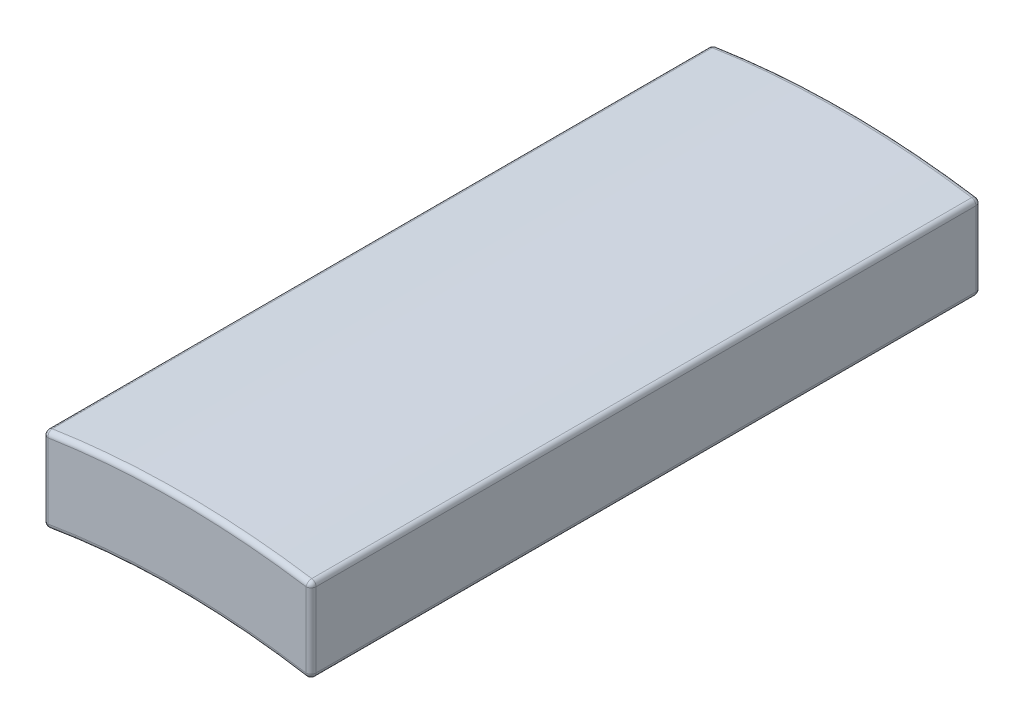
ISO-10303-21;
HEADER;
FILE_DESCRIPTION(('STEP AP214'),'2;1');
FILE_NAME('part.step','',(''),(''),'','','');
FILE_SCHEMA(('AUTOMOTIVE_DESIGN { 1 0 10303 214 1 1 1 1 }'));
ENDSEC;
DATA;
#1=APPLICATION_CONTEXT('core data for automotive mechanical design processes');
#2=APPLICATION_PROTOCOL_DEFINITION('international standard','automotive_design',2000,#1);
#3=PRODUCT_CONTEXT('',#1,'mechanical');
#4=PRODUCT('Part','Part','',(#3));
#5=PRODUCT_RELATED_PRODUCT_CATEGORY('part','',(#4));
#6=PRODUCT_DEFINITION_FORMATION('','',#4);
#7=PRODUCT_DEFINITION_CONTEXT('part definition',#1,'design');
#8=PRODUCT_DEFINITION('design','',#6,#7);
#9=PRODUCT_DEFINITION_SHAPE('','',#8);
#10=(LENGTH_UNIT() NAMED_UNIT(*) SI_UNIT(.MILLI.,.METRE.));
#11=(NAMED_UNIT(*) PLANE_ANGLE_UNIT() SI_UNIT($,.RADIAN.));
#12=(NAMED_UNIT(*) SI_UNIT($,.STERADIAN.) SOLID_ANGLE_UNIT());
#13=UNCERTAINTY_MEASURE_WITH_UNIT(LENGTH_MEASURE(1.E-05),#10,'distance_accuracy_value','');
#14=(GEOMETRIC_REPRESENTATION_CONTEXT(3) GLOBAL_UNCERTAINTY_ASSIGNED_CONTEXT((#13)) GLOBAL_UNIT_ASSIGNED_CONTEXT((#10,
#11,#12)) REPRESENTATION_CONTEXT('',''));
#15=CARTESIAN_POINT('',(0.,0.,0.));
#16=DIRECTION('',(0.,0.,1.));
#17=DIRECTION('',(1.,0.,0.));
#18=AXIS2_PLACEMENT_3D('',#15,#16,#17);
#19=CARTESIAN_POINT('',(3.85,22.8276148556962,0.150000000000001));
#20=DIRECTION('',(1.,0.,0.));
#21=DIRECTION('',(0.,0.,-1.));
#22=AXIS2_PLACEMENT_3D('',#19,#20,#21);
#23=SPHERICAL_SURFACE('',#22,0.15);
#24=CARTESIAN_POINT('',(3.85,22.8276148556962,0.150000000000001));
#25=DIRECTION('',(0.,0.,-1.));
#26=DIRECTION('',(-1.,0.,0.));
#27=AXIS2_PLACEMENT_3D('',#24,#25,#26);
#28=CIRCLE('',#27,0.149999999999999);
#29=CARTESIAN_POINT('',(3.82505399568035,22.6797037443202,0.150000000000001));
#30=VERTEX_POINT('',#29);
#31=CARTESIAN_POINT('',(4.,22.8276148556962,0.150000000000001));
#32=VERTEX_POINT('',#31);
#33=EDGE_CURVE('E63',#30,#32,#28,.F.);
#34=ORIENTED_EDGE('',*,*,#33,.F.);
#35=CARTESIAN_POINT('',(3.85,22.8276148556962,0.150000000000001));
#36=DIRECTION('',(-0.986074075840007,0.166306695464363,0.));
#37=DIRECTION('',(0.166306695464363,0.986074075840007,0.));
#38=AXIS2_PLACEMENT_3D('',#35,#36,#37);
#39=CIRCLE('',#38,0.15);
#40=CARTESIAN_POINT('',(3.85,22.8276148556962,0.));
#41=VERTEX_POINT('',#40);
#42=EDGE_CURVE('E84',#41,#30,#39,.T.);
#43=ORIENTED_EDGE('',*,*,#42,.F.);
#44=CARTESIAN_POINT('',(3.85,22.8276148556962,0.150000000000001));
#45=DIRECTION('',(0.,1.,0.));
#46=DIRECTION('',(0.,0.,1.));
#47=AXIS2_PLACEMENT_3D('',#44,#45,#46);
#48=CIRCLE('',#47,0.15);
#49=EDGE_CURVE('E94',#32,#41,#48,.T.);
#50=ORIENTED_EDGE('',*,*,#49,.F.);
#51=EDGE_LOOP('',(#34,#43,#50));
#52=FACE_BOUND('',#51,.T.);
#53=ADVANCED_FACE('F17',(#52),#23,.T.);
#54=CARTESIAN_POINT('',(-3.85,22.8276148556962,0.150000000000001));
#55=DIRECTION('',(1.,0.,0.));
#56=DIRECTION('',(0.,0.,-1.));
#57=AXIS2_PLACEMENT_3D('',#54,#55,#56);
#58=SPHERICAL_SURFACE('',#57,0.15);
#59=CARTESIAN_POINT('',(-3.85,22.8276148556962,0.150000000000001));
#60=DIRECTION('',(0.,-1.,0.));
#61=DIRECTION('',(0.,0.,-1.));
#62=AXIS2_PLACEMENT_3D('',#59,#60,#61);
#63=CIRCLE('',#62,0.15);
#64=CARTESIAN_POINT('',(-3.85,22.8276148556962,0.));
#65=VERTEX_POINT('',#64);
#66=CARTESIAN_POINT('',(-4.,22.8276148556962,0.150000000000001));
#67=VERTEX_POINT('',#66);
#68=EDGE_CURVE('E78',#65,#67,#63,.F.);
#69=ORIENTED_EDGE('',*,*,#68,.F.);
#70=CARTESIAN_POINT('',(-3.85,22.8276148556962,0.150000000000001));
#71=DIRECTION('',(-0.986074075840007,-0.166306695464363,0.));
#72=DIRECTION('',(-0.166306695464363,0.986074075840007,0.));
#73=AXIS2_PLACEMENT_3D('',#70,#71,#72);
#74=CIRCLE('',#73,0.15);
#75=CARTESIAN_POINT('',(-3.82505399568035,22.6797037443202,0.150000000000001));
#76=VERTEX_POINT('',#75);
#77=EDGE_CURVE('E70',#76,#65,#74,.F.);
#78=ORIENTED_EDGE('',*,*,#77,.F.);
#79=CARTESIAN_POINT('',(-3.85,22.8276148556962,0.150000000000001));
#80=DIRECTION('',(0.,0.,-1.));
#81=DIRECTION('',(-1.,0.,0.));
#82=AXIS2_PLACEMENT_3D('',#79,#80,#81);
#83=CIRCLE('',#82,0.149999999999999);
#84=EDGE_CURVE('E74',#67,#76,#83,.F.);
#85=ORIENTED_EDGE('',*,*,#84,.F.);
#86=EDGE_LOOP('',(#69,#78,#85));
#87=FACE_BOUND('',#86,.T.);
#88=ADVANCED_FACE('F72',(#87),#58,.T.);
#89=CARTESIAN_POINT('',(-3.85,22.8276148556962,19.85));
#90=DIRECTION('',(1.,0.,0.));
#91=DIRECTION('',(0.,0.,-1.));
#92=AXIS2_PLACEMENT_3D('',#89,#90,#91);
#93=SPHERICAL_SURFACE('',#92,0.15);
#94=CARTESIAN_POINT('',(-3.85,22.8276148556962,19.85));
#95=DIRECTION('',(-0.986074075840007,-0.166306695464363,0.));
#96=DIRECTION('',(-0.166306695464363,0.986074075840007,0.));
#97=AXIS2_PLACEMENT_3D('',#94,#95,#96);
#98=CIRCLE('',#97,0.15);
#99=CARTESIAN_POINT('',(-3.85,22.8276148556962,20.));
#100=VERTEX_POINT('',#99);
#101=CARTESIAN_POINT('',(-3.82505399568035,22.6797037443202,19.85));
#102=VERTEX_POINT('',#101);
#103=EDGE_CURVE('E137',#100,#102,#98,.F.);
#104=ORIENTED_EDGE('',*,*,#103,.F.);
#105=CARTESIAN_POINT('',(-3.85,22.8276148556962,19.85));
#106=DIRECTION('',(0.,1.,0.));
#107=DIRECTION('',(0.,0.,1.));
#108=AXIS2_PLACEMENT_3D('',#105,#106,#107);
#109=CIRCLE('',#108,0.150000000000001);
#110=CARTESIAN_POINT('',(-4.,22.8276148556962,19.85));
#111=VERTEX_POINT('',#110);
#112=EDGE_CURVE('E145',#111,#100,#109,.T.);
#113=ORIENTED_EDGE('',*,*,#112,.F.);
#114=CARTESIAN_POINT('',(-3.85,22.8276148556962,19.85));
#115=DIRECTION('',(0.,0.,-1.));
#116=DIRECTION('',(-1.,0.,0.));
#117=AXIS2_PLACEMENT_3D('',#114,#115,#116);
#118=CIRCLE('',#117,0.149999999999999);
#119=EDGE_CURVE('E104',#102,#111,#118,.T.);
#120=ORIENTED_EDGE('',*,*,#119,.F.);
#121=EDGE_LOOP('',(#104,#113,#120));
#122=FACE_BOUND('',#121,.T.);
#123=ADVANCED_FACE('F228',(#122),#93,.T.);
#124=CARTESIAN_POINT('',(0.,0.,20.));
#125=DIRECTION('',(0.,0.,-1.));
#126=DIRECTION('',(-1.,0.,0.));
#127=AXIS2_PLACEMENT_3D('',#124,#125,#126);
#128=CYLINDRICAL_SURFACE('',#127,23.);
#129=CARTESIAN_POINT('',(0.,0.,0.150000000000001));
#130=DIRECTION('',(0.,0.,1.));
#131=DIRECTION('',(1.,0.,0.));
#132=AXIS2_PLACEMENT_3D('',#129,#130,#131);
#133=CIRCLE('',#132,23.);
#134=EDGE_CURVE('E100',#30,#76,#133,.T.);
#135=ORIENTED_EDGE('',*,*,#134,.F.);
#136=DIRECTION('',(0.,0.,-1.));
#137=VECTOR('',#136,1.);
#138=CARTESIAN_POINT('',(3.82505399568035,22.6797037443202,20.));
#139=LINE('',#138,#137);
#140=CARTESIAN_POINT('',(3.82505399568035,22.6797037443202,19.85));
#141=VERTEX_POINT('',#140);
#142=EDGE_CURVE('E113',#141,#30,#139,.T.);
#143=ORIENTED_EDGE('',*,*,#142,.F.);
#144=CARTESIAN_POINT('',(0.,0.,19.85));
#145=DIRECTION('',(0.,0.,1.));
#146=DIRECTION('',(1.,0.,0.));
#147=AXIS2_PLACEMENT_3D('',#144,#145,#146);
#148=CIRCLE('',#147,23.);
#149=EDGE_CURVE('E103',#102,#141,#148,.F.);
#150=ORIENTED_EDGE('',*,*,#149,.F.);
#151=DIRECTION('',(0.,0.,-1.));
#152=VECTOR('',#151,1.);
#153=CARTESIAN_POINT('',(-3.82505399568035,22.6797037443202,20.));
#154=LINE('',#153,#152);
#155=EDGE_CURVE('E91',#76,#102,#154,.F.);
#156=ORIENTED_EDGE('',*,*,#155,.F.);
#157=EDGE_LOOP('',(#135,#143,#150,#156));
#158=FACE_BOUND('',#157,.T.);
#159=ADVANCED_FACE('F99',(#158),#128,.F.);
#160=CARTESIAN_POINT('',(3.85,22.8276148556962,19.85));
#161=DIRECTION('',(1.,0.,0.));
#162=DIRECTION('',(0.,0.,-1.));
#163=AXIS2_PLACEMENT_3D('',#160,#161,#162);
#164=SPHERICAL_SURFACE('',#163,0.15);
#165=CARTESIAN_POINT('',(3.85,22.8276148556962,19.85));
#166=DIRECTION('',(0.,-1.,0.));
#167=DIRECTION('',(0.,0.,-1.));
#168=AXIS2_PLACEMENT_3D('',#165,#166,#167);
#169=CIRCLE('',#168,0.150000000000001);
#170=CARTESIAN_POINT('',(3.85,22.8276148556962,20.));
#171=VERTEX_POINT('',#170);
#172=CARTESIAN_POINT('',(4.,22.8276148556962,19.85));
#173=VERTEX_POINT('',#172);
#174=EDGE_CURVE('E234',#171,#173,#169,.F.);
#175=ORIENTED_EDGE('',*,*,#174,.F.);
#176=CARTESIAN_POINT('',(3.85,22.8276148556962,19.85));
#177=DIRECTION('',(-0.986074075840007,0.166306695464363,0.));
#178=DIRECTION('',(0.166306695464363,0.986074075840007,0.));
#179=AXIS2_PLACEMENT_3D('',#176,#177,#178);
#180=CIRCLE('',#179,0.15);
#181=EDGE_CURVE('E140',#141,#171,#180,.T.);
#182=ORIENTED_EDGE('',*,*,#181,.F.);
#183=CARTESIAN_POINT('',(3.85,22.8276148556962,19.85));
#184=DIRECTION('',(0.,0.,-1.));
#185=DIRECTION('',(-1.,0.,0.));
#186=AXIS2_PLACEMENT_3D('',#183,#184,#185);
#187=CIRCLE('',#186,0.149999999999999);
#188=EDGE_CURVE('E85',#173,#141,#187,.T.);
#189=ORIENTED_EDGE('',*,*,#188,.F.);
#190=EDGE_LOOP('',(#175,#182,#189));
#191=FACE_BOUND('',#190,.T.);
#192=ADVANCED_FACE('F222',(#191),#164,.T.);
#193=CARTESIAN_POINT('',(3.85,22.8276148556962,20.));
#194=DIRECTION('',(0.,0.,-1.));
#195=DIRECTION('',(-1.,0.,0.));
#196=AXIS2_PLACEMENT_3D('',#193,#194,#195);
#197=CYLINDRICAL_SURFACE('',#196,0.149999999999999);
#198=DIRECTION('',(0.,0.,1.));
#199=VECTOR('',#198,1.);
#200=CARTESIAN_POINT('',(4.,22.8276148556962,20.));
#201=LINE('',#200,#199);
#202=EDGE_CURVE('E207',#32,#173,#201,.T.);
#203=ORIENTED_EDGE('',*,*,#202,.T.);
#204=ORIENTED_EDGE('',*,*,#188,.T.);
#205=ORIENTED_EDGE('',*,*,#142,.T.);
#206=ORIENTED_EDGE('',*,*,#33,.T.);
#207=EDGE_LOOP('',(#203,#204,#205,#206));
#208=FACE_BOUND('',#207,.T.);
#209=ADVANCED_FACE('F193',(#208),#197,.T.);
#210=CARTESIAN_POINT('',(0.,0.,0.150000000000001));
#211=DIRECTION('',(0.,0.,1.));
#212=DIRECTION('',(1.,0.,0.));
#213=AXIS2_PLACEMENT_3D('',#210,#211,#212);
#214=TOROIDAL_SURFACE('',#213,23.15,0.15);
#215=ORIENTED_EDGE('',*,*,#42,.T.);
#216=ORIENTED_EDGE('',*,*,#134,.T.);
#217=ORIENTED_EDGE('',*,*,#77,.T.);
#218=CARTESIAN_POINT('',(0.,0.,0.));
#219=DIRECTION('',(0.,0.,-1.));
#220=DIRECTION('',(-0.166306695464363,0.986074075840007,0.));
#221=AXIS2_PLACEMENT_3D('',#218,#219,#220);
#222=CIRCLE('',#221,23.15);
#223=EDGE_CURVE('E458',#65,#41,#222,.T.);
#224=ORIENTED_EDGE('',*,*,#223,.T.);
#225=EDGE_LOOP('',(#215,#216,#217,#224));
#226=FACE_BOUND('',#225,.T.);
#227=ADVANCED_FACE('F106',(#226),#214,.T.);
#228=CARTESIAN_POINT('',(3.85,22.8276148556962,0.150000000000001));
#229=DIRECTION('',(0.,1.,0.));
#230=DIRECTION('',(0.,0.,1.));
#231=AXIS2_PLACEMENT_3D('',#228,#229,#230);
#232=CYLINDRICAL_SURFACE('',#231,0.15);
#233=ORIENTED_EDGE('',*,*,#49,.T.);
#234=DIRECTION('',(0.,1.,0.));
#235=VECTOR('',#234,1.);
#236=CARTESIAN_POINT('',(3.85,22.8276148556962,0.));
#237=LINE('',#236,#235);
#238=CARTESIAN_POINT('',(3.85,25.0559374201006,0.));
#239=VERTEX_POINT('',#238);
#240=EDGE_CURVE('E464',#41,#239,#237,.T.);
#241=ORIENTED_EDGE('',*,*,#240,.T.);
#242=CARTESIAN_POINT('',(3.85,25.0559374201006,0.150000000000001));
#243=DIRECTION('',(0.,1.,0.));
#244=DIRECTION('',(1.,0.,0.));
#245=AXIS2_PLACEMENT_3D('',#242,#243,#244);
#246=CIRCLE('',#245,0.15);
#247=CARTESIAN_POINT('',(4.,25.0559374201006,0.150000000000001));
#248=VERTEX_POINT('',#247);
#249=EDGE_CURVE('E210',#248,#239,#246,.T.);
#250=ORIENTED_EDGE('',*,*,#249,.F.);
#251=DIRECTION('',(0.,1.,0.));
#252=VECTOR('',#251,1.);
#253=CARTESIAN_POINT('',(4.,22.8276148556962,0.150000000000001));
#254=LINE('',#253,#252);
#255=EDGE_CURVE('E211',#248,#32,#254,.F.);
#256=ORIENTED_EDGE('',*,*,#255,.T.);
#257=EDGE_LOOP('',(#233,#241,#250,#256));
#258=FACE_BOUND('',#257,.T.);
#259=ADVANCED_FACE('F192',(#258),#232,.T.);
#260=CARTESIAN_POINT('',(-3.85,22.8276148556962,20.));
#261=DIRECTION('',(0.,0.,-1.));
#262=DIRECTION('',(-1.,0.,0.));
#263=AXIS2_PLACEMENT_3D('',#260,#261,#262);
#264=CYLINDRICAL_SURFACE('',#263,0.149999999999999);
#265=ORIENTED_EDGE('',*,*,#155,.T.);
#266=ORIENTED_EDGE('',*,*,#119,.T.);
#267=DIRECTION('',(0.,0.,-1.));
#268=VECTOR('',#267,1.);
#269=CARTESIAN_POINT('',(-4.,22.8276148556962,20.));
#270=LINE('',#269,#268);
#271=EDGE_CURVE('E93',#111,#67,#270,.T.);
#272=ORIENTED_EDGE('',*,*,#271,.T.);
#273=ORIENTED_EDGE('',*,*,#84,.T.);
#274=EDGE_LOOP('',(#265,#266,#272,#273));
#275=FACE_BOUND('',#274,.T.);
#276=ADVANCED_FACE('F89',(#275),#264,.T.);
#277=CARTESIAN_POINT('',(-3.85,22.8276148556962,0.150000000000001));
#278=DIRECTION('',(0.,-1.,0.));
#279=DIRECTION('',(0.,0.,-1.));
#280=AXIS2_PLACEMENT_3D('',#277,#278,#279);
#281=CYLINDRICAL_SURFACE('',#280,0.15);
#282=ORIENTED_EDGE('',*,*,#68,.T.);
#283=DIRECTION('',(0.,1.,0.));
#284=VECTOR('',#283,1.);
#285=CARTESIAN_POINT('',(-4.,22.8276148556962,0.150000000000001));
#286=LINE('',#285,#284);
#287=CARTESIAN_POINT('',(-4.,25.0559374201006,0.150000000000001));
#288=VERTEX_POINT('',#287);
#289=EDGE_CURVE('E173',#67,#288,#286,.T.);
#290=ORIENTED_EDGE('',*,*,#289,.T.);
#291=CARTESIAN_POINT('',(-3.85,25.0559374201006,0.150000000000001));
#292=DIRECTION('',(0.,1.,0.));
#293=DIRECTION('',(1.,0.,0.));
#294=AXIS2_PLACEMENT_3D('',#291,#292,#293);
#295=CIRCLE('',#294,0.15);
#296=CARTESIAN_POINT('',(-3.85,25.0559374201006,0.));
#297=VERTEX_POINT('',#296);
#298=EDGE_CURVE('E424',#297,#288,#295,.T.);
#299=ORIENTED_EDGE('',*,*,#298,.F.);
#300=DIRECTION('',(0.,1.,0.));
#301=VECTOR('',#300,1.);
#302=CARTESIAN_POINT('',(-3.85,22.8276148556962,0.));
#303=LINE('',#302,#301);
#304=EDGE_CURVE('E455',#297,#65,#303,.F.);
#305=ORIENTED_EDGE('',*,*,#304,.T.);
#306=EDGE_LOOP('',(#282,#290,#299,#305));
#307=FACE_BOUND('',#306,.T.);
#308=ADVANCED_FACE('F259',(#307),#281,.T.);
#309=CARTESIAN_POINT('',(-3.85,22.8276148556962,19.85));
#310=DIRECTION('',(0.,1.,0.));
#311=DIRECTION('',(0.,0.,1.));
#312=AXIS2_PLACEMENT_3D('',#309,#310,#311);
#313=CYLINDRICAL_SURFACE('',#312,0.150000000000001);
#314=ORIENTED_EDGE('',*,*,#112,.T.);
#315=DIRECTION('',(0.,1.,0.));
#316=VECTOR('',#315,1.);
#317=CARTESIAN_POINT('',(-3.85,22.8276148556962,20.));
#318=LINE('',#317,#316);
#319=CARTESIAN_POINT('',(-3.85,25.0559374201006,20.));
#320=VERTEX_POINT('',#319);
#321=EDGE_CURVE('E367',#320,#100,#318,.F.);
#322=ORIENTED_EDGE('',*,*,#321,.F.);
#323=CARTESIAN_POINT('',(-3.85,25.0559374201006,19.85));
#324=DIRECTION('',(0.,-1.,0.));
#325=DIRECTION('',(1.,0.,0.));
#326=AXIS2_PLACEMENT_3D('',#323,#324,#325);
#327=CIRCLE('',#326,0.15);
#328=CARTESIAN_POINT('',(-4.,25.0559374201006,19.85));
#329=VERTEX_POINT('',#328);
#330=EDGE_CURVE('E377',#329,#320,#327,.F.);
#331=ORIENTED_EDGE('',*,*,#330,.F.);
#332=DIRECTION('',(0.,1.,0.));
#333=VECTOR('',#332,1.);
#334=CARTESIAN_POINT('',(-4.,22.8276148556962,19.85));
#335=LINE('',#334,#333);
#336=EDGE_CURVE('E174',#329,#111,#335,.F.);
#337=ORIENTED_EDGE('',*,*,#336,.T.);
#338=EDGE_LOOP('',(#314,#322,#331,#337));
#339=FACE_BOUND('',#338,.T.);
#340=ADVANCED_FACE('F255',(#339),#313,.T.);
#341=CARTESIAN_POINT('',(0.,0.,19.85));
#342=DIRECTION('',(0.,0.,1.));
#343=DIRECTION('',(1.,0.,0.));
#344=AXIS2_PLACEMENT_3D('',#341,#342,#343);
#345=TOROIDAL_SURFACE('',#344,23.15,0.15);
#346=ORIENTED_EDGE('',*,*,#103,.T.);
#347=ORIENTED_EDGE('',*,*,#149,.T.);
#348=ORIENTED_EDGE('',*,*,#181,.T.);
#349=CARTESIAN_POINT('',(0.,0.,20.));
#350=DIRECTION('',(0.,0.,1.));
#351=DIRECTION('',(0.166306695464363,0.986074075840007,0.));
#352=AXIS2_PLACEMENT_3D('',#349,#350,#351);
#353=CIRCLE('',#352,23.15);
#354=EDGE_CURVE('E354',#100,#171,#353,.F.);
#355=ORIENTED_EDGE('',*,*,#354,.F.);
#356=EDGE_LOOP('',(#346,#347,#348,#355));
#357=FACE_BOUND('',#356,.T.);
#358=ADVANCED_FACE('F249',(#357),#345,.T.);
#359=CARTESIAN_POINT('',(3.85,22.8276148556962,19.85));
#360=DIRECTION('',(0.,-1.,0.));
#361=DIRECTION('',(0.,0.,-1.));
#362=AXIS2_PLACEMENT_3D('',#359,#360,#361);
#363=CYLINDRICAL_SURFACE('',#362,0.150000000000001);
#364=CARTESIAN_POINT('',(3.85,25.0559374201006,19.85));
#365=DIRECTION('',(0.,-1.,0.));
#366=DIRECTION('',(1.,0.,0.));
#367=AXIS2_PLACEMENT_3D('',#364,#365,#366);
#368=CIRCLE('',#367,0.15);
#369=CARTESIAN_POINT('',(3.85,25.0559374201006,20.));
#370=VERTEX_POINT('',#369);
#371=CARTESIAN_POINT('',(4.,25.0559374201006,19.85));
#372=VERTEX_POINT('',#371);
#373=EDGE_CURVE('E406',#370,#372,#368,.F.);
#374=ORIENTED_EDGE('',*,*,#373,.F.);
#375=DIRECTION('',(0.,1.,0.));
#376=VECTOR('',#375,1.);
#377=CARTESIAN_POINT('',(3.85,22.8276148556962,20.));
#378=LINE('',#377,#376);
#379=EDGE_CURVE('E351',#171,#370,#378,.T.);
#380=ORIENTED_EDGE('',*,*,#379,.F.);
#381=ORIENTED_EDGE('',*,*,#174,.T.);
#382=DIRECTION('',(0.,1.,0.));
#383=VECTOR('',#382,1.);
#384=CARTESIAN_POINT('',(4.,22.8276148556962,19.85));
#385=LINE('',#384,#383);
#386=EDGE_CURVE('E236',#173,#372,#385,.T.);
#387=ORIENTED_EDGE('',*,*,#386,.T.);
#388=EDGE_LOOP('',(#374,#380,#381,#387));
#389=FACE_BOUND('',#388,.T.);
#390=ADVANCED_FACE('F254',(#389),#363,.T.);
#391=CARTESIAN_POINT('',(4.,22.8276148556962,20.));
#392=DIRECTION('',(-1.,0.,0.));
#393=DIRECTION('',(0.,0.,1.));
#394=AXIS2_PLACEMENT_3D('',#391,#392,#393);
#395=PLANE('',#394);
#396=ORIENTED_EDGE('',*,*,#255,.F.);
#397=DIRECTION('',(0.,0.,-1.));
#398=VECTOR('',#397,1.);
#399=CARTESIAN_POINT('',(4.,25.0559374201006,20.));
#400=LINE('',#399,#398);
#401=EDGE_CURVE('E336',#372,#248,#400,.T.);
#402=ORIENTED_EDGE('',*,*,#401,.F.);
#403=ORIENTED_EDGE('',*,*,#386,.F.);
#404=ORIENTED_EDGE('',*,*,#202,.F.);
#405=EDGE_LOOP('',(#396,#402,#403,#404));
#406=FACE_BOUND('',#405,.T.);
#407=ADVANCED_FACE('F318',(#406),#395,.F.);
#408=CARTESIAN_POINT('',(3.85,25.0559374201006,0.150000000000001));
#409=DIRECTION('',(1.,0.,0.));
#410=DIRECTION('',(0.,0.,-1.));
#411=AXIS2_PLACEMENT_3D('',#408,#409,#410);
#412=SPHERICAL_SURFACE('',#411,0.15);
#413=CARTESIAN_POINT('',(3.85,25.0559374201006,0.150000000000001));
#414=DIRECTION('',(0.,0.,-1.));
#415=DIRECTION('',(-1.,0.,0.));
#416=AXIS2_PLACEMENT_3D('',#413,#414,#415);
#417=CIRCLE('',#416,0.150000000000003);
#418=CARTESIAN_POINT('',(3.87278106508876,25.204197404835,0.150000000000001));
#419=VERTEX_POINT('',#418);
#420=EDGE_CURVE('E343',#248,#419,#417,.F.);
#421=ORIENTED_EDGE('',*,*,#420,.F.);
#422=ORIENTED_EDGE('',*,*,#249,.T.);
#423=CARTESIAN_POINT('',(3.85,25.0559374201006,0.150000000000001));
#424=DIRECTION('',(-0.988399898228822,0.151873767258383,0.));
#425=DIRECTION('',(0.151873767258383,0.988399898228822,0.));
#426=AXIS2_PLACEMENT_3D('',#423,#424,#425);
#427=CIRCLE('',#426,0.15);
#428=EDGE_CURVE('E125',#419,#239,#427,.T.);
#429=ORIENTED_EDGE('',*,*,#428,.F.);
#430=EDGE_LOOP('',(#421,#422,#429));
#431=FACE_BOUND('',#430,.T.);
#432=ADVANCED_FACE('F314',(#431),#412,.T.);
#433=CARTESIAN_POINT('',(-3.85,22.8276148556962,0.));
#434=DIRECTION('',(0.,0.,1.));
#435=DIRECTION('',(1.,0.,0.));
#436=AXIS2_PLACEMENT_3D('',#433,#434,#435);
#437=PLANE('',#436);
#438=ORIENTED_EDGE('',*,*,#223,.F.);
#439=ORIENTED_EDGE('',*,*,#304,.F.);
#440=CARTESIAN_POINT('',(0.,0.,0.));
#441=DIRECTION('',(0.,0.,1.));
#442=DIRECTION('',(0.151873767258383,0.988399898228822,0.));
#443=AXIS2_PLACEMENT_3D('',#440,#441,#442);
#444=CIRCLE('',#443,25.35);
#445=EDGE_CURVE('E128',#239,#297,#444,.T.);
#446=ORIENTED_EDGE('',*,*,#445,.F.);
#447=ORIENTED_EDGE('',*,*,#240,.F.);
#448=EDGE_LOOP('',(#438,#439,#446,#447));
#449=FACE_BOUND('',#448,.T.);
#450=ADVANCED_FACE('F317',(#449),#437,.F.);
#451=CARTESIAN_POINT('',(-3.85,25.0559374201006,0.150000000000001));
#452=DIRECTION('',(1.,0.,0.));
#453=DIRECTION('',(0.,0.,-1.));
#454=AXIS2_PLACEMENT_3D('',#451,#452,#453);
#455=SPHERICAL_SURFACE('',#454,0.15);
#456=CARTESIAN_POINT('',(-3.85,25.0559374201006,0.150000000000001));
#457=DIRECTION('',(-0.988399898228822,-0.151873767258383,0.));
#458=DIRECTION('',(-0.151873767258383,0.988399898228822,0.));
#459=AXIS2_PLACEMENT_3D('',#456,#457,#458);
#460=CIRCLE('',#459,0.15);
#461=CARTESIAN_POINT('',(-3.87278106508876,25.204197404835,0.150000000000001));
#462=VERTEX_POINT('',#461);
#463=EDGE_CURVE('E129',#297,#462,#460,.F.);
#464=ORIENTED_EDGE('',*,*,#463,.F.);
#465=ORIENTED_EDGE('',*,*,#298,.T.);
#466=CARTESIAN_POINT('',(-3.85,25.0559374201006,0.150000000000001));
#467=DIRECTION('',(0.,0.,-1.));
#468=DIRECTION('',(-1.,0.,0.));
#469=AXIS2_PLACEMENT_3D('',#466,#467,#468);
#470=CIRCLE('',#469,0.150000000000003);
#471=EDGE_CURVE('E420',#462,#288,#470,.F.);
#472=ORIENTED_EDGE('',*,*,#471,.F.);
#473=EDGE_LOOP('',(#464,#465,#472));
#474=FACE_BOUND('',#473,.T.);
#475=ADVANCED_FACE('F438',(#474),#455,.T.);
#476=CARTESIAN_POINT('',(-4.,22.8276148556962,20.));
#477=DIRECTION('',(1.,0.,0.));
#478=DIRECTION('',(0.,0.,-1.));
#479=AXIS2_PLACEMENT_3D('',#476,#477,#478);
#480=PLANE('',#479);
#481=ORIENTED_EDGE('',*,*,#289,.F.);
#482=ORIENTED_EDGE('',*,*,#271,.F.);
#483=ORIENTED_EDGE('',*,*,#336,.F.);
#484=DIRECTION('',(0.,0.,-1.));
#485=VECTOR('',#484,1.);
#486=CARTESIAN_POINT('',(-4.,25.0559374201006,20.));
#487=LINE('',#486,#485);
#488=EDGE_CURVE('E417',#288,#329,#487,.F.);
#489=ORIENTED_EDGE('',*,*,#488,.F.);
#490=EDGE_LOOP('',(#481,#482,#483,#489));
#491=FACE_BOUND('',#490,.T.);
#492=ADVANCED_FACE('F401',(#491),#480,.F.);
#493=CARTESIAN_POINT('',(3.85,25.0559374201006,19.85));
#494=DIRECTION('',(1.,0.,0.));
#495=DIRECTION('',(0.,0.,-1.));
#496=AXIS2_PLACEMENT_3D('',#493,#494,#495);
#497=SPHERICAL_SURFACE('',#496,0.15);
#498=CARTESIAN_POINT('',(3.85,25.0559374201006,19.85));
#499=DIRECTION('',(0.,0.,-1.));
#500=DIRECTION('',(-1.,0.,0.));
#501=AXIS2_PLACEMENT_3D('',#498,#499,#500);
#502=CIRCLE('',#501,0.150000000000003);
#503=CARTESIAN_POINT('',(3.87278106508876,25.204197404835,19.85));
#504=VERTEX_POINT('',#503);
#505=EDGE_CURVE('E134',#504,#372,#502,.T.);
#506=ORIENTED_EDGE('',*,*,#505,.F.);
#507=CARTESIAN_POINT('',(3.85,25.0559374201006,19.85));
#508=DIRECTION('',(-0.988399898228822,0.151873767258383,0.));
#509=DIRECTION('',(0.151873767258383,0.988399898228822,0.));
#510=AXIS2_PLACEMENT_3D('',#507,#508,#509);
#511=CIRCLE('',#510,0.15);
#512=EDGE_CURVE('E117',#370,#504,#511,.T.);
#513=ORIENTED_EDGE('',*,*,#512,.F.);
#514=ORIENTED_EDGE('',*,*,#373,.T.);
#515=EDGE_LOOP('',(#506,#513,#514));
#516=FACE_BOUND('',#515,.T.);
#517=ADVANCED_FACE('F396',(#516),#497,.T.);
#518=CARTESIAN_POINT('',(-3.85,25.0559374201006,19.85));
#519=DIRECTION('',(1.,0.,0.));
#520=DIRECTION('',(0.,0.,-1.));
#521=AXIS2_PLACEMENT_3D('',#518,#519,#520);
#522=SPHERICAL_SURFACE('',#521,0.15);
#523=CARTESIAN_POINT('',(-3.85,25.0559374201006,19.85));
#524=DIRECTION('',(0.,0.,-1.));
#525=DIRECTION('',(-1.,0.,0.));
#526=AXIS2_PLACEMENT_3D('',#523,#524,#525);
#527=CIRCLE('',#526,0.150000000000003);
#528=CARTESIAN_POINT('',(-3.87278106508876,25.204197404835,19.85));
#529=VERTEX_POINT('',#528);
#530=EDGE_CURVE('E122',#329,#529,#527,.T.);
#531=ORIENTED_EDGE('',*,*,#530,.F.);
#532=ORIENTED_EDGE('',*,*,#330,.T.);
#533=CARTESIAN_POINT('',(-3.85,25.0559374201006,19.85));
#534=DIRECTION('',(-0.988399898228822,-0.151873767258383,0.));
#535=DIRECTION('',(-0.151873767258383,0.988399898228822,0.));
#536=AXIS2_PLACEMENT_3D('',#533,#534,#535);
#537=CIRCLE('',#536,0.15);
#538=EDGE_CURVE('E36',#529,#320,#537,.F.);
#539=ORIENTED_EDGE('',*,*,#538,.F.);
#540=EDGE_LOOP('',(#531,#532,#539));
#541=FACE_BOUND('',#540,.T.);
#542=ADVANCED_FACE('F392',(#541),#522,.T.);
#543=CARTESIAN_POINT('',(-3.85,22.8276148556962,20.));
#544=DIRECTION('',(0.,0.,1.));
#545=DIRECTION('',(1.,0.,0.));
#546=AXIS2_PLACEMENT_3D('',#543,#544,#545);
#547=PLANE('',#546);
#548=ORIENTED_EDGE('',*,*,#354,.T.);
#549=ORIENTED_EDGE('',*,*,#379,.T.);
#550=CARTESIAN_POINT('',(0.,0.,20.));
#551=DIRECTION('',(0.,0.,-1.));
#552=DIRECTION('',(-0.151873767258383,0.988399898228822,0.));
#553=AXIS2_PLACEMENT_3D('',#550,#551,#552);
#554=CIRCLE('',#553,25.35);
#555=EDGE_CURVE('E116',#320,#370,#554,.T.);
#556=ORIENTED_EDGE('',*,*,#555,.F.);
#557=ORIENTED_EDGE('',*,*,#321,.T.);
#558=EDGE_LOOP('',(#548,#549,#556,#557));
#559=FACE_BOUND('',#558,.T.);
#560=ADVANCED_FACE('F395',(#559),#547,.T.);
#561=CARTESIAN_POINT('',(3.85,25.0559374201006,20.));
#562=DIRECTION('',(0.,0.,-1.));
#563=DIRECTION('',(-1.,0.,0.));
#564=AXIS2_PLACEMENT_3D('',#561,#562,#563);
#565=CYLINDRICAL_SURFACE('',#564,0.150000000000003);
#566=DIRECTION('',(0.,0.,-1.));
#567=VECTOR('',#566,1.);
#568=CARTESIAN_POINT('',(3.87278106508876,25.204197404835,20.));
#569=LINE('',#568,#567);
#570=EDGE_CURVE('E410',#504,#419,#569,.T.);
#571=ORIENTED_EDGE('',*,*,#570,.F.);
#572=ORIENTED_EDGE('',*,*,#505,.T.);
#573=ORIENTED_EDGE('',*,*,#401,.T.);
#574=ORIENTED_EDGE('',*,*,#420,.T.);
#575=EDGE_LOOP('',(#571,#572,#573,#574));
#576=FACE_BOUND('',#575,.T.);
#577=ADVANCED_FACE('F295',(#576),#565,.T.);
#578=CARTESIAN_POINT('',(0.,0.,0.150000000000001));
#579=DIRECTION('',(0.,0.,1.));
#580=DIRECTION('',(1.,0.,0.));
#581=AXIS2_PLACEMENT_3D('',#578,#579,#580);
#582=TOROIDAL_SURFACE('',#581,25.35,0.15);
#583=ORIENTED_EDGE('',*,*,#428,.T.);
#584=ORIENTED_EDGE('',*,*,#445,.T.);
#585=ORIENTED_EDGE('',*,*,#463,.T.);
#586=CARTESIAN_POINT('',(0.,0.,0.150000000000001));
#587=DIRECTION('',(0.,0.,-1.));
#588=DIRECTION('',(-1.,0.,0.));
#589=AXIS2_PLACEMENT_3D('',#586,#587,#588);
#590=CIRCLE('',#589,25.5);
#591=EDGE_CURVE('E413',#419,#462,#590,.F.);
#592=ORIENTED_EDGE('',*,*,#591,.F.);
#593=EDGE_LOOP('',(#583,#584,#585,#592));
#594=FACE_BOUND('',#593,.T.);
#595=ADVANCED_FACE('F291',(#594),#582,.T.);
#596=CARTESIAN_POINT('',(-3.85,25.0559374201006,20.));
#597=DIRECTION('',(0.,0.,-1.));
#598=DIRECTION('',(-1.,0.,0.));
#599=AXIS2_PLACEMENT_3D('',#596,#597,#598);
#600=CYLINDRICAL_SURFACE('',#599,0.150000000000003);
#601=ORIENTED_EDGE('',*,*,#488,.T.);
#602=ORIENTED_EDGE('',*,*,#530,.T.);
#603=DIRECTION('',(0.,0.,-1.));
#604=VECTOR('',#603,1.);
#605=CARTESIAN_POINT('',(-3.87278106508876,25.204197404835,20.));
#606=LINE('',#605,#604);
#607=EDGE_CURVE('E27',#462,#529,#606,.F.);
#608=ORIENTED_EDGE('',*,*,#607,.F.);
#609=ORIENTED_EDGE('',*,*,#471,.T.);
#610=EDGE_LOOP('',(#601,#602,#608,#609));
#611=FACE_BOUND('',#610,.T.);
#612=ADVANCED_FACE('F276',(#611),#600,.T.);
#613=CARTESIAN_POINT('',(0.,0.,19.85));
#614=DIRECTION('',(0.,0.,1.));
#615=DIRECTION('',(1.,0.,0.));
#616=AXIS2_PLACEMENT_3D('',#613,#614,#615);
#617=TOROIDAL_SURFACE('',#616,25.35,0.15);
#618=ORIENTED_EDGE('',*,*,#538,.T.);
#619=ORIENTED_EDGE('',*,*,#555,.T.);
#620=ORIENTED_EDGE('',*,*,#512,.T.);
#621=CARTESIAN_POINT('',(0.,0.,19.85));
#622=DIRECTION('',(0.,0.,-1.));
#623=DIRECTION('',(-1.,0.,0.));
#624=AXIS2_PLACEMENT_3D('',#621,#622,#623);
#625=CIRCLE('',#624,25.5);
#626=EDGE_CURVE('E11',#529,#504,#625,.T.);
#627=ORIENTED_EDGE('',*,*,#626,.F.);
#628=EDGE_LOOP('',(#618,#619,#620,#627));
#629=FACE_BOUND('',#628,.T.);
#630=ADVANCED_FACE('F270',(#629),#617,.T.);
#631=CARTESIAN_POINT('',(0.,0.,20.));
#632=DIRECTION('',(0.,0.,-1.));
#633=DIRECTION('',(-1.,0.,0.));
#634=AXIS2_PLACEMENT_3D('',#631,#632,#633);
#635=CYLINDRICAL_SURFACE('',#634,25.5);
#636=ORIENTED_EDGE('',*,*,#607,.T.);
#637=ORIENTED_EDGE('',*,*,#626,.T.);
#638=ORIENTED_EDGE('',*,*,#570,.T.);
#639=ORIENTED_EDGE('',*,*,#591,.T.);
#640=EDGE_LOOP('',(#636,#637,#638,#639));
#641=FACE_BOUND('',#640,.T.);
#642=ADVANCED_FACE('F268',(#641),#635,.T.);
#643=CLOSED_SHELL('',(#53,#88,#123,#159,#192,#209,#227,#259,#276,#308,#340,#358,#390,#407,#432,
#450,#475,#492,#517,#542,#560,#577,#595,#612,#630,#642));
#644=MANIFOLD_SOLID_BREP('B1',#643);
#645=ADVANCED_BREP_SHAPE_REPRESENTATION('',(#18,#644),#14);
#646=SHAPE_DEFINITION_REPRESENTATION(#9,#645);
ENDSEC;
END-ISO-10303-21;
